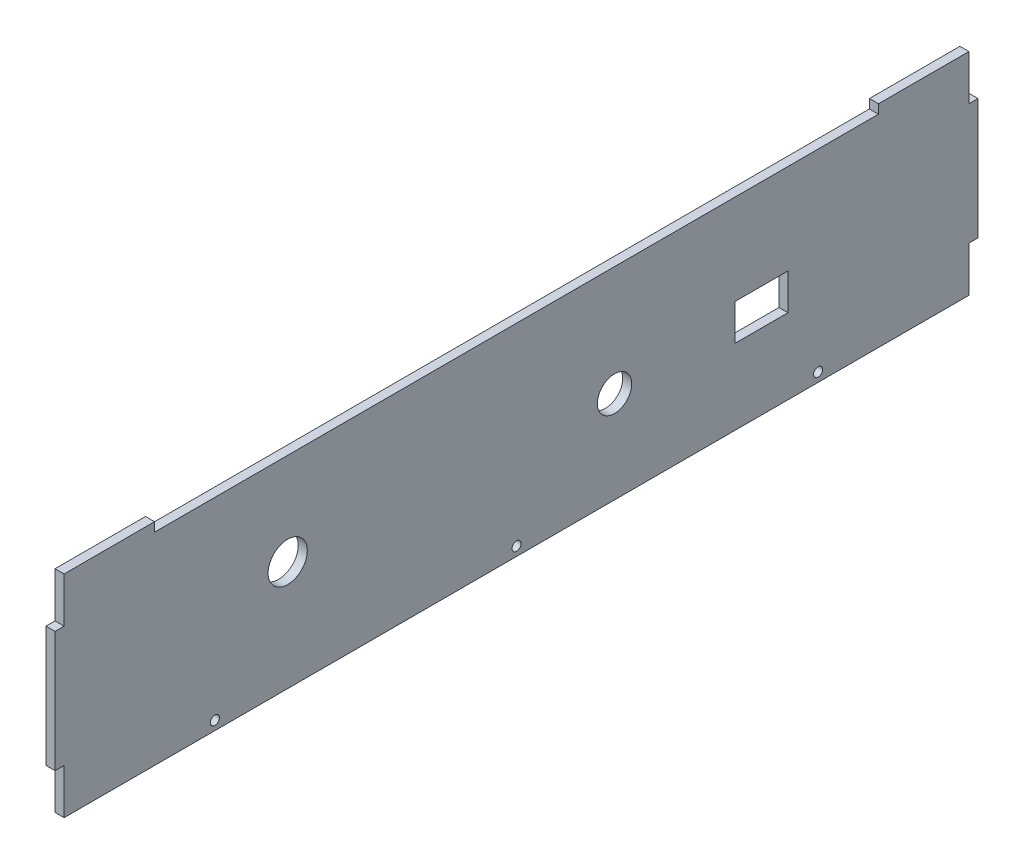
ISO-10303-21;
HEADER;
FILE_DESCRIPTION(('STEP AP214'),'2;1');
FILE_NAME('part.step','',(''),(''),'','','');
FILE_SCHEMA(('AUTOMOTIVE_DESIGN { 1 0 10303 214 1 1 1 1 }'));
ENDSEC;
DATA;
#1=APPLICATION_CONTEXT('core data for automotive mechanical design processes');
#2=APPLICATION_PROTOCOL_DEFINITION('international standard','automotive_design',2000,#1);
#3=PRODUCT_CONTEXT('',#1,'mechanical');
#4=PRODUCT('Part','Part','',(#3));
#5=PRODUCT_RELATED_PRODUCT_CATEGORY('part','',(#4));
#6=PRODUCT_DEFINITION_FORMATION('','',#4);
#7=PRODUCT_DEFINITION_CONTEXT('part definition',#1,'design');
#8=PRODUCT_DEFINITION('design','',#6,#7);
#9=PRODUCT_DEFINITION_SHAPE('','',#8);
#10=(LENGTH_UNIT() NAMED_UNIT(*) SI_UNIT(.MILLI.,.METRE.));
#11=(NAMED_UNIT(*) PLANE_ANGLE_UNIT() SI_UNIT($,.RADIAN.));
#12=(NAMED_UNIT(*) SI_UNIT($,.STERADIAN.) SOLID_ANGLE_UNIT());
#13=UNCERTAINTY_MEASURE_WITH_UNIT(LENGTH_MEASURE(1.E-05),#10,'distance_accuracy_value','');
#14=(GEOMETRIC_REPRESENTATION_CONTEXT(3) GLOBAL_UNCERTAINTY_ASSIGNED_CONTEXT((#13)) GLOBAL_UNIT_ASSIGNED_CONTEXT((#10,
#11,#12)) REPRESENTATION_CONTEXT('',''));
#15=CARTESIAN_POINT('',(0.,0.,0.));
#16=DIRECTION('',(0.,0.,1.));
#17=DIRECTION('',(1.,0.,0.));
#18=AXIS2_PLACEMENT_3D('',#15,#16,#17);
#19=CARTESIAN_POINT('',(3.,70.,-18.8554035164088));
#20=DIRECTION('',(0.,-1.,0.));
#21=DIRECTION('',(0.,0.,-1.));
#22=AXIS2_PLACEMENT_3D('',#19,#20,#21);
#23=PLANE('',#22);
#24=DIRECTION('',(-1.,0.,0.));
#25=VECTOR('',#24,1.);
#26=CARTESIAN_POINT('',(399.14847413057,70.,-288.855403516409));
#27=LINE('',#26,#25);
#28=CARTESIAN_POINT('',(3.,70.,-288.855403516409));
#29=VERTEX_POINT('',#28);
#30=CARTESIAN_POINT('',(0.,70.,-288.855403516409));
#31=VERTEX_POINT('',#30);
#32=EDGE_CURVE('E219',#29,#31,#27,.T.);
#33=ORIENTED_EDGE('',*,*,#32,.F.);
#34=DIRECTION('',(0.,0.,1.));
#35=VECTOR('',#34,1.);
#36=CARTESIAN_POINT('',(3.,70.,-18.8554035164088));
#37=LINE('',#36,#35);
#38=CARTESIAN_POINT('',(3.,70.,-318.855403516409));
#39=VERTEX_POINT('',#38);
#40=EDGE_CURVE('E251',#39,#29,#37,.T.);
#41=ORIENTED_EDGE('',*,*,#40,.F.);
#42=DIRECTION('',(-1.,0.,0.));
#43=VECTOR('',#42,1.);
#44=CARTESIAN_POINT('',(3.,70.,-318.855403516409));
#45=LINE('',#44,#43);
#46=CARTESIAN_POINT('',(0.,70.,-318.855403516409));
#47=VERTEX_POINT('',#46);
#48=EDGE_CURVE('E282',#39,#47,#45,.T.);
#49=ORIENTED_EDGE('',*,*,#48,.T.);
#50=DIRECTION('',(0.,0.,1.));
#51=VECTOR('',#50,1.);
#52=CARTESIAN_POINT('',(0.,70.,-18.8554035164088));
#53=LINE('',#52,#51);
#54=EDGE_CURVE('E230',#47,#31,#53,.T.);
#55=ORIENTED_EDGE('',*,*,#54,.T.);
#56=EDGE_LOOP('',(#33,#41,#49,#55));
#57=FACE_BOUND('',#56,.T.);
#58=ADVANCED_FACE('F33',(#57),#23,.F.);
#59=DIRECTION('',(-1.,0.,0.));
#60=VECTOR('',#59,1.);
#61=CARTESIAN_POINT('',(399.14847413057,70.,-48.8554035164088));
#62=LINE('',#61,#60);
#63=CARTESIAN_POINT('',(3.,70.,-48.8554035164088));
#64=VERTEX_POINT('',#63);
#65=CARTESIAN_POINT('',(0.,70.,-48.8554035164088));
#66=VERTEX_POINT('',#65);
#67=EDGE_CURVE('E203',#64,#66,#62,.T.);
#68=ORIENTED_EDGE('',*,*,#67,.T.);
#69=CARTESIAN_POINT('',(0.,70.,-18.8554035164088));
#70=VERTEX_POINT('',#69);
#71=EDGE_CURVE('E277',#66,#70,#53,.T.);
#72=ORIENTED_EDGE('',*,*,#71,.T.);
#73=DIRECTION('',(-1.,0.,0.));
#74=VECTOR('',#73,1.);
#75=CARTESIAN_POINT('',(3.,70.,-18.8554035164088));
#76=LINE('',#75,#74);
#77=CARTESIAN_POINT('',(3.,70.,-18.8554035164088));
#78=VERTEX_POINT('',#77);
#79=EDGE_CURVE('E254',#78,#70,#76,.T.);
#80=ORIENTED_EDGE('',*,*,#79,.F.);
#81=EDGE_CURVE('E250',#64,#78,#37,.T.);
#82=ORIENTED_EDGE('',*,*,#81,.F.);
#83=EDGE_LOOP('',(#68,#72,#80,#82));
#84=FACE_BOUND('',#83,.T.);
#85=ADVANCED_FACE('F353',(#84),#23,.F.);
#86=CARTESIAN_POINT('',(3.,0.,0.));
#87=DIRECTION('',(-1.,0.,0.));
#88=DIRECTION('',(0.,0.,1.));
#89=AXIS2_PLACEMENT_3D('',#86,#87,#88);
#90=PLANE('',#89);
#91=CARTESIAN_POINT('',(3.,2.9999999999986,-68.8554035164088));
#92=DIRECTION('',(1.,0.,0.));
#93=DIRECTION('',(0.,0.,-1.));
#94=AXIS2_PLACEMENT_3D('',#91,#92,#93);
#95=CIRCLE('',#94,1.50000000000002);
#96=CARTESIAN_POINT('',(3.,2.9999999999986,-70.3554035164088));
#97=VERTEX_POINT('',#96);
#98=EDGE_CURVE('E342',#97,#97,#95,.T.);
#99=ORIENTED_EDGE('',*,*,#98,.F.);
#100=EDGE_LOOP('',(#99));
#101=FACE_BOUND('',#100,.T.);
#102=CARTESIAN_POINT('',(3.,2.9999999999993,-168.855403516409));
#103=DIRECTION('',(1.,0.,0.));
#104=DIRECTION('',(0.,0.,-1.));
#105=AXIS2_PLACEMENT_3D('',#102,#103,#104);
#106=CIRCLE('',#105,1.50000000000002);
#107=CARTESIAN_POINT('',(3.,2.9999999999993,-170.355403516409));
#108=VERTEX_POINT('',#107);
#109=EDGE_CURVE('E332',#108,#108,#106,.T.);
#110=ORIENTED_EDGE('',*,*,#109,.F.);
#111=EDGE_LOOP('',(#110));
#112=FACE_BOUND('',#111,.T.);
#113=CARTESIAN_POINT('',(3.,3.,-268.855403516409));
#114=DIRECTION('',(1.,0.,0.));
#115=DIRECTION('',(0.,0.,-1.));
#116=AXIS2_PLACEMENT_3D('',#113,#114,#115);
#117=CIRCLE('',#116,1.50000000000002);
#118=CARTESIAN_POINT('',(3.,3.,-270.355403516409));
#119=VERTEX_POINT('',#118);
#120=EDGE_CURVE('E329',#119,#119,#117,.T.);
#121=ORIENTED_EDGE('',*,*,#120,.F.);
#122=EDGE_LOOP('',(#121));
#123=FACE_BOUND('',#122,.T.);
#124=CARTESIAN_POINT('',(3.,36.3821516166781,-92.9906370009634));
#125=DIRECTION('',(1.,0.,0.));
#126=DIRECTION('',(0.,0.,-1.));
#127=AXIS2_PLACEMENT_3D('',#124,#125,#126);
#128=CIRCLE('',#127,6.5);
#129=CARTESIAN_POINT('',(3.,36.3821516166781,-99.4906370009634));
#130=VERTEX_POINT('',#129);
#131=EDGE_CURVE('E326',#130,#130,#128,.T.);
#132=ORIENTED_EDGE('',*,*,#131,.F.);
#133=EDGE_LOOP('',(#132));
#134=FACE_BOUND('',#133,.T.);
#135=CARTESIAN_POINT('',(3.,30.5,-201.355403516409));
#136=DIRECTION('',(1.,0.,0.));
#137=DIRECTION('',(0.,0.,-1.));
#138=AXIS2_PLACEMENT_3D('',#135,#136,#137);
#139=CIRCLE('',#138,5.70000000000001);
#140=CARTESIAN_POINT('',(3.,30.5,-207.055403516409));
#141=VERTEX_POINT('',#140);
#142=EDGE_CURVE('E322',#141,#141,#139,.T.);
#143=ORIENTED_EDGE('',*,*,#142,.F.);
#144=EDGE_LOOP('',(#143));
#145=FACE_BOUND('',#144,.T.);
#146=DIRECTION('',(0.,0.,-1.));
#147=VECTOR('',#146,1.);
#148=CARTESIAN_POINT('',(3.,25.,-241.355403516409));
#149=LINE('',#148,#147);
#150=CARTESIAN_POINT('',(3.,25.,-241.355403516409));
#151=VERTEX_POINT('',#150);
#152=CARTESIAN_POINT('',(3.,25.,-258.855403516409));
#153=VERTEX_POINT('',#152);
#154=EDGE_CURVE('E183',#151,#153,#149,.T.);
#155=ORIENTED_EDGE('',*,*,#154,.F.);
#156=DIRECTION('',(0.,-1.,0.));
#157=VECTOR('',#156,1.);
#158=CARTESIAN_POINT('',(3.,37.,-241.355403516409));
#159=LINE('',#158,#157);
#160=CARTESIAN_POINT('',(3.,37.,-241.355403516409));
#161=VERTEX_POINT('',#160);
#162=EDGE_CURVE('E50',#161,#151,#159,.T.);
#163=ORIENTED_EDGE('',*,*,#162,.F.);
#164=DIRECTION('',(0.,0.,1.));
#165=VECTOR('',#164,1.);
#166=CARTESIAN_POINT('',(3.,37.,-241.355403516409));
#167=LINE('',#166,#165);
#168=CARTESIAN_POINT('',(3.,37.,-258.855403516409));
#169=VERTEX_POINT('',#168);
#170=EDGE_CURVE('E190',#169,#161,#167,.T.);
#171=ORIENTED_EDGE('',*,*,#170,.F.);
#172=DIRECTION('',(0.,1.,0.));
#173=VECTOR('',#172,1.);
#174=CARTESIAN_POINT('',(3.,37.,-258.855403516409));
#175=LINE('',#174,#173);
#176=EDGE_CURVE('E174',#153,#169,#175,.T.);
#177=ORIENTED_EDGE('',*,*,#176,.F.);
#178=EDGE_LOOP('',(#155,#163,#171,#177));
#179=FACE_BOUND('',#178,.T.);
#180=DIRECTION('',(0.,-1.,0.));
#181=VECTOR('',#180,1.);
#182=CARTESIAN_POINT('',(3.,67.,-288.855403516409));
#183=LINE('',#182,#181);
#184=CARTESIAN_POINT('',(3.,67.,-288.855403516409));
#185=VERTEX_POINT('',#184);
#186=EDGE_CURVE('E197',#29,#185,#183,.T.);
#187=ORIENTED_EDGE('',*,*,#186,.T.);
#188=DIRECTION('',(0.,0.,1.));
#189=VECTOR('',#188,1.);
#190=CARTESIAN_POINT('',(3.,67.,-48.8554035164088));
#191=LINE('',#190,#189);
#192=CARTESIAN_POINT('',(3.,67.,-48.8554035164088));
#193=VERTEX_POINT('',#192);
#194=EDGE_CURVE('E212',#185,#193,#191,.T.);
#195=ORIENTED_EDGE('',*,*,#194,.T.);
#196=DIRECTION('',(0.,1.,0.));
#197=VECTOR('',#196,1.);
#198=CARTESIAN_POINT('',(3.,70.,-48.8554035164088));
#199=LINE('',#198,#197);
#200=EDGE_CURVE('E208',#193,#64,#199,.T.);
#201=ORIENTED_EDGE('',*,*,#200,.T.);
#202=ORIENTED_EDGE('',*,*,#81,.T.);
#203=DIRECTION('',(0.,-1.,0.));
#204=VECTOR('',#203,1.);
#205=CARTESIAN_POINT('',(3.,55.,-18.8554035164088));
#206=LINE('',#205,#204);
#207=CARTESIAN_POINT('',(3.,55.,-18.8554035164088));
#208=VERTEX_POINT('',#207);
#209=EDGE_CURVE('E226',#78,#208,#206,.T.);
#210=ORIENTED_EDGE('',*,*,#209,.T.);
#211=DIRECTION('',(0.,0.,1.));
#212=VECTOR('',#211,1.);
#213=CARTESIAN_POINT('',(3.,55.,-15.8554035164088));
#214=LINE('',#213,#212);
#215=CARTESIAN_POINT('',(3.,55.,-15.8554035164088));
#216=VERTEX_POINT('',#215);
#217=EDGE_CURVE('E229',#208,#216,#214,.T.);
#218=ORIENTED_EDGE('',*,*,#217,.T.);
#219=DIRECTION('',(0.,-1.,0.));
#220=VECTOR('',#219,1.);
#221=CARTESIAN_POINT('',(3.,15.,-15.8554035164088));
#222=LINE('',#221,#220);
#223=CARTESIAN_POINT('',(3.,15.,-15.8554035164088));
#224=VERTEX_POINT('',#223);
#225=EDGE_CURVE('E232',#216,#224,#222,.T.);
#226=ORIENTED_EDGE('',*,*,#225,.T.);
#227=DIRECTION('',(0.,0.,-1.));
#228=VECTOR('',#227,1.);
#229=CARTESIAN_POINT('',(3.,15.,-18.8554035164088));
#230=LINE('',#229,#228);
#231=CARTESIAN_POINT('',(3.,15.,-18.8554035164088));
#232=VERTEX_POINT('',#231);
#233=EDGE_CURVE('E234',#224,#232,#230,.T.);
#234=ORIENTED_EDGE('',*,*,#233,.T.);
#235=DIRECTION('',(0.,-1.,0.));
#236=VECTOR('',#235,1.);
#237=CARTESIAN_POINT('',(3.,0.,-18.8554035164088));
#238=LINE('',#237,#236);
#239=CARTESIAN_POINT('',(3.,0.,-18.8554035164088));
#240=VERTEX_POINT('',#239);
#241=EDGE_CURVE('E236',#232,#240,#238,.T.);
#242=ORIENTED_EDGE('',*,*,#241,.T.);
#243=DIRECTION('',(0.,0.,-1.));
#244=VECTOR('',#243,1.);
#245=CARTESIAN_POINT('',(3.,0.,-318.855403516409));
#246=LINE('',#245,#244);
#247=CARTESIAN_POINT('',(3.,0.,-318.855403516409));
#248=VERTEX_POINT('',#247);
#249=EDGE_CURVE('E238',#240,#248,#246,.T.);
#250=ORIENTED_EDGE('',*,*,#249,.T.);
#251=DIRECTION('',(0.,1.,0.));
#252=VECTOR('',#251,1.);
#253=CARTESIAN_POINT('',(3.,15.,-318.855403516409));
#254=LINE('',#253,#252);
#255=CARTESIAN_POINT('',(3.,15.,-318.855403516409));
#256=VERTEX_POINT('',#255);
#257=EDGE_CURVE('E240',#248,#256,#254,.T.);
#258=ORIENTED_EDGE('',*,*,#257,.T.);
#259=DIRECTION('',(0.,0.,-1.));
#260=VECTOR('',#259,1.);
#261=CARTESIAN_POINT('',(3.,15.,-321.855403516409));
#262=LINE('',#261,#260);
#263=CARTESIAN_POINT('',(3.,15.,-321.855403516409));
#264=VERTEX_POINT('',#263);
#265=EDGE_CURVE('E242',#256,#264,#262,.T.);
#266=ORIENTED_EDGE('',*,*,#265,.T.);
#267=DIRECTION('',(0.,1.,0.));
#268=VECTOR('',#267,1.);
#269=CARTESIAN_POINT('',(3.,55.,-321.855403516409));
#270=LINE('',#269,#268);
#271=CARTESIAN_POINT('',(3.,55.,-321.855403516409));
#272=VERTEX_POINT('',#271);
#273=EDGE_CURVE('E244',#264,#272,#270,.T.);
#274=ORIENTED_EDGE('',*,*,#273,.T.);
#275=DIRECTION('',(0.,0.,1.));
#276=VECTOR('',#275,1.);
#277=CARTESIAN_POINT('',(3.,55.,-318.855403516409));
#278=LINE('',#277,#276);
#279=CARTESIAN_POINT('',(3.,55.,-318.855403516409));
#280=VERTEX_POINT('',#279);
#281=EDGE_CURVE('E246',#272,#280,#278,.T.);
#282=ORIENTED_EDGE('',*,*,#281,.T.);
#283=DIRECTION('',(0.,1.,0.));
#284=VECTOR('',#283,1.);
#285=CARTESIAN_POINT('',(3.,70.,-318.855403516409));
#286=LINE('',#285,#284);
#287=EDGE_CURVE('E248',#280,#39,#286,.T.);
#288=ORIENTED_EDGE('',*,*,#287,.T.);
#289=ORIENTED_EDGE('',*,*,#40,.T.);
#290=EDGE_LOOP('',(#187,#195,#201,#202,#210,#218,#226,#234,#242,#250,#258,#266,#274,#282,#288,#289));
#291=FACE_BOUND('',#290,.T.);
#292=ADVANCED_FACE('F187',(#101,#112,#123,#134,#145,#179,#291),#90,.F.);
#293=CARTESIAN_POINT('',(3.,55.,-18.8554035164088));
#294=DIRECTION('',(0.,0.,-1.));
#295=DIRECTION('',(-1.,0.,0.));
#296=AXIS2_PLACEMENT_3D('',#293,#294,#295);
#297=PLANE('',#296);
#298=DIRECTION('',(0.,-1.,0.));
#299=VECTOR('',#298,1.);
#300=CARTESIAN_POINT('',(0.,55.,-18.8554035164088));
#301=LINE('',#300,#299);
#302=CARTESIAN_POINT('',(0.,55.,-18.8554035164088));
#303=VERTEX_POINT('',#302);
#304=EDGE_CURVE('E225',#70,#303,#301,.T.);
#305=ORIENTED_EDGE('',*,*,#304,.T.);
#306=DIRECTION('',(-1.,0.,0.));
#307=VECTOR('',#306,1.);
#308=CARTESIAN_POINT('',(3.,55.,-18.8554035164088));
#309=LINE('',#308,#307);
#310=EDGE_CURVE('E312',#208,#303,#309,.T.);
#311=ORIENTED_EDGE('',*,*,#310,.F.);
#312=ORIENTED_EDGE('',*,*,#209,.F.);
#313=ORIENTED_EDGE('',*,*,#79,.T.);
#314=EDGE_LOOP('',(#305,#311,#312,#313));
#315=FACE_BOUND('',#314,.T.);
#316=ADVANCED_FACE('F35',(#315),#297,.F.);
#317=CARTESIAN_POINT('',(3.,55.,-15.8554035164088));
#318=DIRECTION('',(0.,-1.,0.));
#319=DIRECTION('',(0.,0.,-1.));
#320=AXIS2_PLACEMENT_3D('',#317,#318,#319);
#321=PLANE('',#320);
#322=DIRECTION('',(0.,0.,1.));
#323=VECTOR('',#322,1.);
#324=CARTESIAN_POINT('',(0.,55.,-15.8554035164088));
#325=LINE('',#324,#323);
#326=CARTESIAN_POINT('',(0.,55.,-15.8554035164088));
#327=VERTEX_POINT('',#326);
#328=EDGE_CURVE('E257',#303,#327,#325,.T.);
#329=ORIENTED_EDGE('',*,*,#328,.T.);
#330=DIRECTION('',(-1.,0.,0.));
#331=VECTOR('',#330,1.);
#332=CARTESIAN_POINT('',(3.,55.,-15.8554035164088));
#333=LINE('',#332,#331);
#334=EDGE_CURVE('E309',#216,#327,#333,.T.);
#335=ORIENTED_EDGE('',*,*,#334,.F.);
#336=ORIENTED_EDGE('',*,*,#217,.F.);
#337=ORIENTED_EDGE('',*,*,#310,.T.);
#338=EDGE_LOOP('',(#329,#335,#336,#337));
#339=FACE_BOUND('',#338,.T.);
#340=ADVANCED_FACE('F360',(#339),#321,.F.);
#341=CARTESIAN_POINT('',(3.,15.,-15.8554035164088));
#342=DIRECTION('',(0.,0.,-1.));
#343=DIRECTION('',(-1.,0.,0.));
#344=AXIS2_PLACEMENT_3D('',#341,#342,#343);
#345=PLANE('',#344);
#346=DIRECTION('',(0.,-1.,0.));
#347=VECTOR('',#346,1.);
#348=CARTESIAN_POINT('',(0.,15.,-15.8554035164088));
#349=LINE('',#348,#347);
#350=CARTESIAN_POINT('',(0.,15.,-15.8554035164088));
#351=VERTEX_POINT('',#350);
#352=EDGE_CURVE('E259',#327,#351,#349,.T.);
#353=ORIENTED_EDGE('',*,*,#352,.T.);
#354=DIRECTION('',(-1.,0.,0.));
#355=VECTOR('',#354,1.);
#356=CARTESIAN_POINT('',(3.,15.,-15.8554035164088));
#357=LINE('',#356,#355);
#358=EDGE_CURVE('E306',#224,#351,#357,.T.);
#359=ORIENTED_EDGE('',*,*,#358,.F.);
#360=ORIENTED_EDGE('',*,*,#225,.F.);
#361=ORIENTED_EDGE('',*,*,#334,.T.);
#362=EDGE_LOOP('',(#353,#359,#360,#361));
#363=FACE_BOUND('',#362,.T.);
#364=ADVANCED_FACE('F405',(#363),#345,.F.);
#365=CARTESIAN_POINT('',(3.,15.,-18.8554035164088));
#366=DIRECTION('',(0.,1.,0.));
#367=DIRECTION('',(0.,0.,1.));
#368=AXIS2_PLACEMENT_3D('',#365,#366,#367);
#369=PLANE('',#368);
#370=DIRECTION('',(0.,0.,-1.));
#371=VECTOR('',#370,1.);
#372=CARTESIAN_POINT('',(0.,15.,-18.8554035164088));
#373=LINE('',#372,#371);
#374=CARTESIAN_POINT('',(0.,15.,-18.8554035164088));
#375=VERTEX_POINT('',#374);
#376=EDGE_CURVE('E261',#351,#375,#373,.T.);
#377=ORIENTED_EDGE('',*,*,#376,.T.);
#378=DIRECTION('',(-1.,0.,0.));
#379=VECTOR('',#378,1.);
#380=CARTESIAN_POINT('',(3.,15.,-18.8554035164088));
#381=LINE('',#380,#379);
#382=EDGE_CURVE('E303',#232,#375,#381,.T.);
#383=ORIENTED_EDGE('',*,*,#382,.F.);
#384=ORIENTED_EDGE('',*,*,#233,.F.);
#385=ORIENTED_EDGE('',*,*,#358,.T.);
#386=EDGE_LOOP('',(#377,#383,#384,#385));
#387=FACE_BOUND('',#386,.T.);
#388=ADVANCED_FACE('F401',(#387),#369,.F.);
#389=CARTESIAN_POINT('',(3.,0.,-18.8554035164088));
#390=DIRECTION('',(0.,0.,-1.));
#391=DIRECTION('',(-1.,0.,0.));
#392=AXIS2_PLACEMENT_3D('',#389,#390,#391);
#393=PLANE('',#392);
#394=DIRECTION('',(0.,-1.,0.));
#395=VECTOR('',#394,1.);
#396=CARTESIAN_POINT('',(0.,0.,-18.8554035164088));
#397=LINE('',#396,#395);
#398=CARTESIAN_POINT('',(0.,0.,-18.8554035164088));
#399=VERTEX_POINT('',#398);
#400=EDGE_CURVE('E263',#375,#399,#397,.T.);
#401=ORIENTED_EDGE('',*,*,#400,.T.);
#402=DIRECTION('',(-1.,0.,0.));
#403=VECTOR('',#402,1.);
#404=CARTESIAN_POINT('',(3.,0.,-18.8554035164088));
#405=LINE('',#404,#403);
#406=EDGE_CURVE('E300',#240,#399,#405,.T.);
#407=ORIENTED_EDGE('',*,*,#406,.F.);
#408=ORIENTED_EDGE('',*,*,#241,.F.);
#409=ORIENTED_EDGE('',*,*,#382,.T.);
#410=EDGE_LOOP('',(#401,#407,#408,#409));
#411=FACE_BOUND('',#410,.T.);
#412=ADVANCED_FACE('F397',(#411),#393,.F.);
#413=CARTESIAN_POINT('',(3.,0.,-318.855403516409));
#414=DIRECTION('',(0.,1.,0.));
#415=DIRECTION('',(0.,0.,1.));
#416=AXIS2_PLACEMENT_3D('',#413,#414,#415);
#417=PLANE('',#416);
#418=DIRECTION('',(0.,0.,-1.));
#419=VECTOR('',#418,1.);
#420=CARTESIAN_POINT('',(0.,0.,-318.855403516409));
#421=LINE('',#420,#419);
#422=CARTESIAN_POINT('',(0.,0.,-318.855403516409));
#423=VERTEX_POINT('',#422);
#424=EDGE_CURVE('E265',#399,#423,#421,.T.);
#425=ORIENTED_EDGE('',*,*,#424,.T.);
#426=DIRECTION('',(-1.,0.,0.));
#427=VECTOR('',#426,1.);
#428=CARTESIAN_POINT('',(3.,0.,-318.855403516409));
#429=LINE('',#428,#427);
#430=EDGE_CURVE('E297',#248,#423,#429,.T.);
#431=ORIENTED_EDGE('',*,*,#430,.F.);
#432=ORIENTED_EDGE('',*,*,#249,.F.);
#433=ORIENTED_EDGE('',*,*,#406,.T.);
#434=EDGE_LOOP('',(#425,#431,#432,#433));
#435=FACE_BOUND('',#434,.T.);
#436=ADVANCED_FACE('F393',(#435),#417,.F.);
#437=CARTESIAN_POINT('',(3.,15.,-318.855403516409));
#438=DIRECTION('',(0.,0.,1.));
#439=DIRECTION('',(1.,0.,0.));
#440=AXIS2_PLACEMENT_3D('',#437,#438,#439);
#441=PLANE('',#440);
#442=DIRECTION('',(0.,1.,0.));
#443=VECTOR('',#442,1.);
#444=CARTESIAN_POINT('',(0.,15.,-318.855403516409));
#445=LINE('',#444,#443);
#446=CARTESIAN_POINT('',(0.,15.,-318.855403516409));
#447=VERTEX_POINT('',#446);
#448=EDGE_CURVE('E267',#423,#447,#445,.T.);
#449=ORIENTED_EDGE('',*,*,#448,.T.);
#450=DIRECTION('',(-1.,0.,0.));
#451=VECTOR('',#450,1.);
#452=CARTESIAN_POINT('',(3.,15.,-318.855403516409));
#453=LINE('',#452,#451);
#454=EDGE_CURVE('E294',#256,#447,#453,.T.);
#455=ORIENTED_EDGE('',*,*,#454,.F.);
#456=ORIENTED_EDGE('',*,*,#257,.F.);
#457=ORIENTED_EDGE('',*,*,#430,.T.);
#458=EDGE_LOOP('',(#449,#455,#456,#457));
#459=FACE_BOUND('',#458,.T.);
#460=ADVANCED_FACE('F389',(#459),#441,.F.);
#461=CARTESIAN_POINT('',(3.,15.,-321.855403516409));
#462=DIRECTION('',(0.,1.,0.));
#463=DIRECTION('',(0.,0.,1.));
#464=AXIS2_PLACEMENT_3D('',#461,#462,#463);
#465=PLANE('',#464);
#466=DIRECTION('',(0.,0.,-1.));
#467=VECTOR('',#466,1.);
#468=CARTESIAN_POINT('',(0.,15.,-321.855403516409));
#469=LINE('',#468,#467);
#470=CARTESIAN_POINT('',(0.,15.,-321.855403516409));
#471=VERTEX_POINT('',#470);
#472=EDGE_CURVE('E269',#447,#471,#469,.T.);
#473=ORIENTED_EDGE('',*,*,#472,.T.);
#474=DIRECTION('',(-1.,0.,0.));
#475=VECTOR('',#474,1.);
#476=CARTESIAN_POINT('',(3.,15.,-321.855403516409));
#477=LINE('',#476,#475);
#478=EDGE_CURVE('E291',#264,#471,#477,.T.);
#479=ORIENTED_EDGE('',*,*,#478,.F.);
#480=ORIENTED_EDGE('',*,*,#265,.F.);
#481=ORIENTED_EDGE('',*,*,#454,.T.);
#482=EDGE_LOOP('',(#473,#479,#480,#481));
#483=FACE_BOUND('',#482,.T.);
#484=ADVANCED_FACE('F385',(#483),#465,.F.);
#485=CARTESIAN_POINT('',(3.,55.,-321.855403516409));
#486=DIRECTION('',(0.,0.,1.));
#487=DIRECTION('',(1.,0.,0.));
#488=AXIS2_PLACEMENT_3D('',#485,#486,#487);
#489=PLANE('',#488);
#490=DIRECTION('',(0.,1.,0.));
#491=VECTOR('',#490,1.);
#492=CARTESIAN_POINT('',(0.,55.,-321.855403516409));
#493=LINE('',#492,#491);
#494=CARTESIAN_POINT('',(0.,55.,-321.855403516409));
#495=VERTEX_POINT('',#494);
#496=EDGE_CURVE('E271',#471,#495,#493,.T.);
#497=ORIENTED_EDGE('',*,*,#496,.T.);
#498=DIRECTION('',(-1.,0.,0.));
#499=VECTOR('',#498,1.);
#500=CARTESIAN_POINT('',(3.,55.,-321.855403516409));
#501=LINE('',#500,#499);
#502=EDGE_CURVE('E288',#272,#495,#501,.T.);
#503=ORIENTED_EDGE('',*,*,#502,.F.);
#504=ORIENTED_EDGE('',*,*,#273,.F.);
#505=ORIENTED_EDGE('',*,*,#478,.T.);
#506=EDGE_LOOP('',(#497,#503,#504,#505));
#507=FACE_BOUND('',#506,.T.);
#508=ADVANCED_FACE('F381',(#507),#489,.F.);
#509=CARTESIAN_POINT('',(3.,55.,-318.855403516409));
#510=DIRECTION('',(0.,-1.,0.));
#511=DIRECTION('',(0.,0.,-1.));
#512=AXIS2_PLACEMENT_3D('',#509,#510,#511);
#513=PLANE('',#512);
#514=DIRECTION('',(0.,0.,1.));
#515=VECTOR('',#514,1.);
#516=CARTESIAN_POINT('',(0.,55.,-318.855403516409));
#517=LINE('',#516,#515);
#518=CARTESIAN_POINT('',(0.,55.,-318.855403516409));
#519=VERTEX_POINT('',#518);
#520=EDGE_CURVE('E273',#495,#519,#517,.T.);
#521=ORIENTED_EDGE('',*,*,#520,.T.);
#522=DIRECTION('',(-1.,0.,0.));
#523=VECTOR('',#522,1.);
#524=CARTESIAN_POINT('',(3.,55.,-318.855403516409));
#525=LINE('',#524,#523);
#526=EDGE_CURVE('E285',#280,#519,#525,.T.);
#527=ORIENTED_EDGE('',*,*,#526,.F.);
#528=ORIENTED_EDGE('',*,*,#281,.F.);
#529=ORIENTED_EDGE('',*,*,#502,.T.);
#530=EDGE_LOOP('',(#521,#527,#528,#529));
#531=FACE_BOUND('',#530,.T.);
#532=ADVANCED_FACE('F377',(#531),#513,.F.);
#533=CARTESIAN_POINT('',(3.,70.,-318.855403516409));
#534=DIRECTION('',(0.,0.,1.));
#535=DIRECTION('',(1.,0.,0.));
#536=AXIS2_PLACEMENT_3D('',#533,#534,#535);
#537=PLANE('',#536);
#538=DIRECTION('',(0.,1.,0.));
#539=VECTOR('',#538,1.);
#540=CARTESIAN_POINT('',(0.,70.,-318.855403516409));
#541=LINE('',#540,#539);
#542=EDGE_CURVE('E275',#519,#47,#541,.T.);
#543=ORIENTED_EDGE('',*,*,#542,.T.);
#544=ORIENTED_EDGE('',*,*,#48,.F.);
#545=ORIENTED_EDGE('',*,*,#287,.F.);
#546=ORIENTED_EDGE('',*,*,#526,.T.);
#547=EDGE_LOOP('',(#543,#544,#545,#546));
#548=FACE_BOUND('',#547,.T.);
#549=ADVANCED_FACE('F374',(#548),#537,.F.);
#550=CARTESIAN_POINT('',(0.,0.,0.));
#551=DIRECTION('',(-1.,0.,0.));
#552=DIRECTION('',(0.,0.,1.));
#553=AXIS2_PLACEMENT_3D('',#550,#551,#552);
#554=PLANE('',#553);
#555=CARTESIAN_POINT('',(0.,2.9999999999986,-68.8554035164088));
#556=DIRECTION('',(-1.,0.,0.));
#557=DIRECTION('',(0.,0.,1.));
#558=AXIS2_PLACEMENT_3D('',#555,#556,#557);
#559=CIRCLE('',#558,1.50000000000002);
#560=CARTESIAN_POINT('',(0.,2.9999999999986,-67.3554035164088));
#561=VERTEX_POINT('',#560);
#562=EDGE_CURVE('E37',#561,#561,#559,.T.);
#563=ORIENTED_EDGE('',*,*,#562,.F.);
#564=EDGE_LOOP('',(#563));
#565=FACE_BOUND('',#564,.T.);
#566=CARTESIAN_POINT('',(0.,2.9999999999993,-168.855403516409));
#567=DIRECTION('',(-1.,0.,0.));
#568=DIRECTION('',(0.,0.,1.));
#569=AXIS2_PLACEMENT_3D('',#566,#567,#568);
#570=CIRCLE('',#569,1.50000000000002);
#571=CARTESIAN_POINT('',(0.,2.9999999999993,-167.355403516409));
#572=VERTEX_POINT('',#571);
#573=EDGE_CURVE('E330',#572,#572,#570,.T.);
#574=ORIENTED_EDGE('',*,*,#573,.F.);
#575=EDGE_LOOP('',(#574));
#576=FACE_BOUND('',#575,.T.);
#577=CARTESIAN_POINT('',(0.,3.,-268.855403516409));
#578=DIRECTION('',(-1.,0.,0.));
#579=DIRECTION('',(0.,0.,1.));
#580=AXIS2_PLACEMENT_3D('',#577,#578,#579);
#581=CIRCLE('',#580,1.50000000000002);
#582=CARTESIAN_POINT('',(0.,3.,-267.355403516409));
#583=VERTEX_POINT('',#582);
#584=EDGE_CURVE('E327',#583,#583,#581,.T.);
#585=ORIENTED_EDGE('',*,*,#584,.F.);
#586=EDGE_LOOP('',(#585));
#587=FACE_BOUND('',#586,.T.);
#588=CARTESIAN_POINT('',(0.,36.3821516166781,-92.9906370009634));
#589=DIRECTION('',(-1.,0.,0.));
#590=DIRECTION('',(0.,0.,1.));
#591=AXIS2_PLACEMENT_3D('',#588,#589,#590);
#592=CIRCLE('',#591,6.5);
#593=CARTESIAN_POINT('',(0.,36.3821516166781,-86.4906370009634));
#594=VERTEX_POINT('',#593);
#595=EDGE_CURVE('E323',#594,#594,#592,.T.);
#596=ORIENTED_EDGE('',*,*,#595,.F.);
#597=EDGE_LOOP('',(#596));
#598=FACE_BOUND('',#597,.T.);
#599=CARTESIAN_POINT('',(0.,30.5,-201.355403516409));
#600=DIRECTION('',(-1.,0.,0.));
#601=DIRECTION('',(0.,0.,1.));
#602=AXIS2_PLACEMENT_3D('',#599,#600,#601);
#603=CIRCLE('',#602,5.70000000000001);
#604=CARTESIAN_POINT('',(0.,30.5,-195.655403516409));
#605=VERTEX_POINT('',#604);
#606=EDGE_CURVE('E319',#605,#605,#603,.T.);
#607=ORIENTED_EDGE('',*,*,#606,.F.);
#608=EDGE_LOOP('',(#607));
#609=FACE_BOUND('',#608,.T.);
#610=DIRECTION('',(0.,1.,0.));
#611=VECTOR('',#610,1.);
#612=CARTESIAN_POINT('',(0.,0.,-241.355403516409));
#613=LINE('',#612,#611);
#614=CARTESIAN_POINT('',(0.,25.,-241.355403516409));
#615=VERTEX_POINT('',#614);
#616=CARTESIAN_POINT('',(0.,37.,-241.355403516409));
#617=VERTEX_POINT('',#616);
#618=EDGE_CURVE('E11',#615,#617,#613,.T.);
#619=ORIENTED_EDGE('',*,*,#618,.F.);
#620=DIRECTION('',(0.,0.,1.));
#621=VECTOR('',#620,1.);
#622=CARTESIAN_POINT('',(0.,25.,0.));
#623=LINE('',#622,#621);
#624=CARTESIAN_POINT('',(0.,25.,-258.855403516409));
#625=VERTEX_POINT('',#624);
#626=EDGE_CURVE('E315',#625,#615,#623,.T.);
#627=ORIENTED_EDGE('',*,*,#626,.F.);
#628=DIRECTION('',(0.,-1.,0.));
#629=VECTOR('',#628,1.);
#630=CARTESIAN_POINT('',(0.,0.,-258.855403516409));
#631=LINE('',#630,#629);
#632=CARTESIAN_POINT('',(0.,37.,-258.855403516409));
#633=VERTEX_POINT('',#632);
#634=EDGE_CURVE('E177',#633,#625,#631,.T.);
#635=ORIENTED_EDGE('',*,*,#634,.F.);
#636=DIRECTION('',(0.,0.,-1.));
#637=VECTOR('',#636,1.);
#638=CARTESIAN_POINT('',(0.,36.9999999999999,0.));
#639=LINE('',#638,#637);
#640=EDGE_CURVE('E42',#617,#633,#639,.T.);
#641=ORIENTED_EDGE('',*,*,#640,.F.);
#642=EDGE_LOOP('',(#619,#627,#635,#641));
#643=FACE_BOUND('',#642,.T.);
#644=DIRECTION('',(0.,1.,0.));
#645=VECTOR('',#644,1.);
#646=CARTESIAN_POINT('',(0.,70.,-48.8554035164088));
#647=LINE('',#646,#645);
#648=CARTESIAN_POINT('',(0.,67.,-48.8554035164088));
#649=VERTEX_POINT('',#648);
#650=EDGE_CURVE('E205',#649,#66,#647,.T.);
#651=ORIENTED_EDGE('',*,*,#650,.F.);
#652=DIRECTION('',(0.,0.,1.));
#653=VECTOR('',#652,1.);
#654=CARTESIAN_POINT('',(0.,67.,-48.8554035164088));
#655=LINE('',#654,#653);
#656=CARTESIAN_POINT('',(0.,67.,-288.855403516409));
#657=VERTEX_POINT('',#656);
#658=EDGE_CURVE('E204',#657,#649,#655,.T.);
#659=ORIENTED_EDGE('',*,*,#658,.F.);
#660=DIRECTION('',(0.,-1.,0.));
#661=VECTOR('',#660,1.);
#662=CARTESIAN_POINT('',(0.,67.,-288.855403516409));
#663=LINE('',#662,#661);
#664=EDGE_CURVE('E200',#31,#657,#663,.T.);
#665=ORIENTED_EDGE('',*,*,#664,.F.);
#666=ORIENTED_EDGE('',*,*,#54,.F.);
#667=ORIENTED_EDGE('',*,*,#542,.F.);
#668=ORIENTED_EDGE('',*,*,#520,.F.);
#669=ORIENTED_EDGE('',*,*,#496,.F.);
#670=ORIENTED_EDGE('',*,*,#472,.F.);
#671=ORIENTED_EDGE('',*,*,#448,.F.);
#672=ORIENTED_EDGE('',*,*,#424,.F.);
#673=ORIENTED_EDGE('',*,*,#400,.F.);
#674=ORIENTED_EDGE('',*,*,#376,.F.);
#675=ORIENTED_EDGE('',*,*,#352,.F.);
#676=ORIENTED_EDGE('',*,*,#328,.F.);
#677=ORIENTED_EDGE('',*,*,#304,.F.);
#678=ORIENTED_EDGE('',*,*,#71,.F.);
#679=EDGE_LOOP('',(#651,#659,#665,#666,#667,#668,#669,#670,#671,#672,#673,#674,#675,#676,#677,#678));
#680=FACE_BOUND('',#679,.T.);
#681=ADVANCED_FACE('F373',(#565,#576,#587,#598,#609,#643,#680),#554,.T.);
#682=CARTESIAN_POINT('',(399.14847413057,67.,-288.855403516409));
#683=DIRECTION('',(0.,0.,1.));
#684=DIRECTION('',(1.,0.,0.));
#685=AXIS2_PLACEMENT_3D('',#682,#683,#684);
#686=PLANE('',#685);
#687=ORIENTED_EDGE('',*,*,#186,.F.);
#688=ORIENTED_EDGE('',*,*,#32,.T.);
#689=ORIENTED_EDGE('',*,*,#664,.T.);
#690=DIRECTION('',(-1.,0.,0.));
#691=VECTOR('',#690,1.);
#692=CARTESIAN_POINT('',(399.14847413057,67.,-288.855403516409));
#693=LINE('',#692,#691);
#694=EDGE_CURVE('E222',#185,#657,#693,.T.);
#695=ORIENTED_EDGE('',*,*,#694,.F.);
#696=EDGE_LOOP('',(#687,#688,#689,#695));
#697=FACE_BOUND('',#696,.T.);
#698=ADVANCED_FACE('F445',(#697),#686,.T.);
#699=CARTESIAN_POINT('',(399.14847413057,67.,-48.8554035164088));
#700=DIRECTION('',(0.,1.,0.));
#701=DIRECTION('',(0.,0.,1.));
#702=AXIS2_PLACEMENT_3D('',#699,#700,#701);
#703=PLANE('',#702);
#704=ORIENTED_EDGE('',*,*,#194,.F.);
#705=ORIENTED_EDGE('',*,*,#694,.T.);
#706=ORIENTED_EDGE('',*,*,#658,.T.);
#707=DIRECTION('',(-1.,0.,0.));
#708=VECTOR('',#707,1.);
#709=CARTESIAN_POINT('',(399.14847413057,67.,-48.8554035164088));
#710=LINE('',#709,#708);
#711=EDGE_CURVE('E216',#193,#649,#710,.T.);
#712=ORIENTED_EDGE('',*,*,#711,.F.);
#713=EDGE_LOOP('',(#704,#705,#706,#712));
#714=FACE_BOUND('',#713,.T.);
#715=ADVANCED_FACE('F440',(#714),#703,.T.);
#716=CARTESIAN_POINT('',(399.14847413057,70.,-48.8554035164088));
#717=DIRECTION('',(0.,0.,-1.));
#718=DIRECTION('',(-1.,0.,0.));
#719=AXIS2_PLACEMENT_3D('',#716,#717,#718);
#720=PLANE('',#719);
#721=ORIENTED_EDGE('',*,*,#200,.F.);
#722=ORIENTED_EDGE('',*,*,#711,.T.);
#723=ORIENTED_EDGE('',*,*,#650,.T.);
#724=ORIENTED_EDGE('',*,*,#67,.F.);
#725=EDGE_LOOP('',(#721,#722,#723,#724));
#726=FACE_BOUND('',#725,.T.);
#727=ADVANCED_FACE('F436',(#726),#720,.T.);
#728=CARTESIAN_POINT('',(-7.,37.,-241.355403516409));
#729=DIRECTION('',(0.,0.,1.));
#730=DIRECTION('',(1.,0.,0.));
#731=AXIS2_PLACEMENT_3D('',#728,#729,#730);
#732=PLANE('',#731);
#733=ORIENTED_EDGE('',*,*,#618,.T.);
#734=DIRECTION('',(1.,0.,0.));
#735=VECTOR('',#734,1.);
#736=CARTESIAN_POINT('',(-7.,37.,-241.355403516409));
#737=LINE('',#736,#735);
#738=EDGE_CURVE('E195',#617,#161,#737,.T.);
#739=ORIENTED_EDGE('',*,*,#738,.T.);
#740=ORIENTED_EDGE('',*,*,#162,.T.);
#741=DIRECTION('',(1.,0.,0.));
#742=VECTOR('',#741,1.);
#743=CARTESIAN_POINT('',(-7.,25.,-241.355403516409));
#744=LINE('',#743,#742);
#745=EDGE_CURVE('E180',#615,#151,#744,.T.);
#746=ORIENTED_EDGE('',*,*,#745,.F.);
#747=EDGE_LOOP('',(#733,#739,#740,#746));
#748=FACE_BOUND('',#747,.T.);
#749=ADVANCED_FACE('F472',(#748),#732,.F.);
#750=CARTESIAN_POINT('',(-7.,37.,-241.355403516409));
#751=DIRECTION('',(0.,1.,0.));
#752=DIRECTION('',(0.,0.,1.));
#753=AXIS2_PLACEMENT_3D('',#750,#751,#752);
#754=PLANE('',#753);
#755=ORIENTED_EDGE('',*,*,#640,.T.);
#756=DIRECTION('',(1.,0.,0.));
#757=VECTOR('',#756,1.);
#758=CARTESIAN_POINT('',(-7.,37.,-258.855403516409));
#759=LINE('',#758,#757);
#760=EDGE_CURVE('E179',#633,#169,#759,.T.);
#761=ORIENTED_EDGE('',*,*,#760,.T.);
#762=ORIENTED_EDGE('',*,*,#170,.T.);
#763=ORIENTED_EDGE('',*,*,#738,.F.);
#764=EDGE_LOOP('',(#755,#761,#762,#763));
#765=FACE_BOUND('',#764,.T.);
#766=ADVANCED_FACE('F475',(#765),#754,.F.);
#767=CARTESIAN_POINT('',(-7.,37.,-258.855403516409));
#768=DIRECTION('',(0.,0.,-1.));
#769=DIRECTION('',(-1.,0.,0.));
#770=AXIS2_PLACEMENT_3D('',#767,#768,#769);
#771=PLANE('',#770);
#772=ORIENTED_EDGE('',*,*,#634,.T.);
#773=DIRECTION('',(1.,0.,0.));
#774=VECTOR('',#773,1.);
#775=CARTESIAN_POINT('',(-7.,25.,-258.855403516409));
#776=LINE('',#775,#774);
#777=EDGE_CURVE('E58',#625,#153,#776,.T.);
#778=ORIENTED_EDGE('',*,*,#777,.T.);
#779=ORIENTED_EDGE('',*,*,#176,.T.);
#780=ORIENTED_EDGE('',*,*,#760,.F.);
#781=EDGE_LOOP('',(#772,#778,#779,#780));
#782=FACE_BOUND('',#781,.T.);
#783=ADVANCED_FACE('F171',(#782),#771,.F.);
#784=CARTESIAN_POINT('',(-7.,25.,-241.355403516409));
#785=DIRECTION('',(0.,-1.,0.));
#786=DIRECTION('',(0.,0.,-1.));
#787=AXIS2_PLACEMENT_3D('',#784,#785,#786);
#788=PLANE('',#787);
#789=ORIENTED_EDGE('',*,*,#626,.T.);
#790=ORIENTED_EDGE('',*,*,#745,.T.);
#791=ORIENTED_EDGE('',*,*,#154,.T.);
#792=ORIENTED_EDGE('',*,*,#777,.F.);
#793=EDGE_LOOP('',(#789,#790,#791,#792));
#794=FACE_BOUND('',#793,.T.);
#795=ADVANCED_FACE('F184',(#794),#788,.F.);
#796=CARTESIAN_POINT('',(-7.,30.5,-201.355403516409));
#797=DIRECTION('',(1.,0.,0.));
#798=DIRECTION('',(0.,0.,-1.));
#799=AXIS2_PLACEMENT_3D('',#796,#797,#798);
#800=CYLINDRICAL_SURFACE('',#799,5.70000000000001);
#801=ORIENTED_EDGE('',*,*,#606,.T.);
#802=EDGE_LOOP('',(#801));
#803=FACE_BOUND('',#802,.T.);
#804=ORIENTED_EDGE('',*,*,#142,.T.);
#805=EDGE_LOOP('',(#804));
#806=FACE_BOUND('',#805,.T.);
#807=ADVANCED_FACE('F350',(#803,#806),#800,.F.);
#808=CARTESIAN_POINT('',(-7.,36.3821516166781,-92.9906370009634));
#809=DIRECTION('',(1.,0.,0.));
#810=DIRECTION('',(0.,0.,-1.));
#811=AXIS2_PLACEMENT_3D('',#808,#809,#810);
#812=CYLINDRICAL_SURFACE('',#811,6.5);
#813=ORIENTED_EDGE('',*,*,#595,.T.);
#814=EDGE_LOOP('',(#813));
#815=FACE_BOUND('',#814,.T.);
#816=ORIENTED_EDGE('',*,*,#131,.T.);
#817=EDGE_LOOP('',(#816));
#818=FACE_BOUND('',#817,.T.);
#819=ADVANCED_FACE('F485',(#815,#818),#812,.F.);
#820=CARTESIAN_POINT('',(-7.,3.,-268.855403516409));
#821=DIRECTION('',(1.,0.,0.));
#822=DIRECTION('',(0.,0.,-1.));
#823=AXIS2_PLACEMENT_3D('',#820,#821,#822);
#824=CYLINDRICAL_SURFACE('',#823,1.50000000000002);
#825=ORIENTED_EDGE('',*,*,#584,.T.);
#826=EDGE_LOOP('',(#825));
#827=FACE_BOUND('',#826,.T.);
#828=ORIENTED_EDGE('',*,*,#120,.T.);
#829=EDGE_LOOP('',(#828));
#830=FACE_BOUND('',#829,.T.);
#831=ADVANCED_FACE('F489',(#827,#830),#824,.F.);
#832=CARTESIAN_POINT('',(-7.,2.9999999999993,-168.855403516409));
#833=DIRECTION('',(1.,0.,0.));
#834=DIRECTION('',(0.,0.,-1.));
#835=AXIS2_PLACEMENT_3D('',#832,#833,#834);
#836=CYLINDRICAL_SURFACE('',#835,1.50000000000002);
#837=ORIENTED_EDGE('',*,*,#573,.T.);
#838=EDGE_LOOP('',(#837));
#839=FACE_BOUND('',#838,.T.);
#840=ORIENTED_EDGE('',*,*,#109,.T.);
#841=EDGE_LOOP('',(#840));
#842=FACE_BOUND('',#841,.T.);
#843=ADVANCED_FACE('F493',(#839,#842),#836,.F.);
#844=CARTESIAN_POINT('',(-7.,2.9999999999986,-68.8554035164088));
#845=DIRECTION('',(1.,0.,0.));
#846=DIRECTION('',(0.,0.,-1.));
#847=AXIS2_PLACEMENT_3D('',#844,#845,#846);
#848=CYLINDRICAL_SURFACE('',#847,1.50000000000002);
#849=ORIENTED_EDGE('',*,*,#562,.T.);
#850=EDGE_LOOP('',(#849));
#851=FACE_BOUND('',#850,.T.);
#852=ORIENTED_EDGE('',*,*,#98,.T.);
#853=EDGE_LOOP('',(#852));
#854=FACE_BOUND('',#853,.T.);
#855=ADVANCED_FACE('F497',(#851,#854),#848,.F.);
#856=CLOSED_SHELL('',(#58,#85,#292,#316,#340,#364,#388,#412,#436,#460,#484,#508,#532,#549,#681,
#698,#715,#727,#749,#766,#783,#795,#807,#819,#831,#843,#855));
#857=MANIFOLD_SOLID_BREP('B2',#856);
#858=ADVANCED_BREP_SHAPE_REPRESENTATION('',(#18,#857),#14);
#859=SHAPE_DEFINITION_REPRESENTATION(#9,#858);
ENDSEC;
END-ISO-10303-21;
